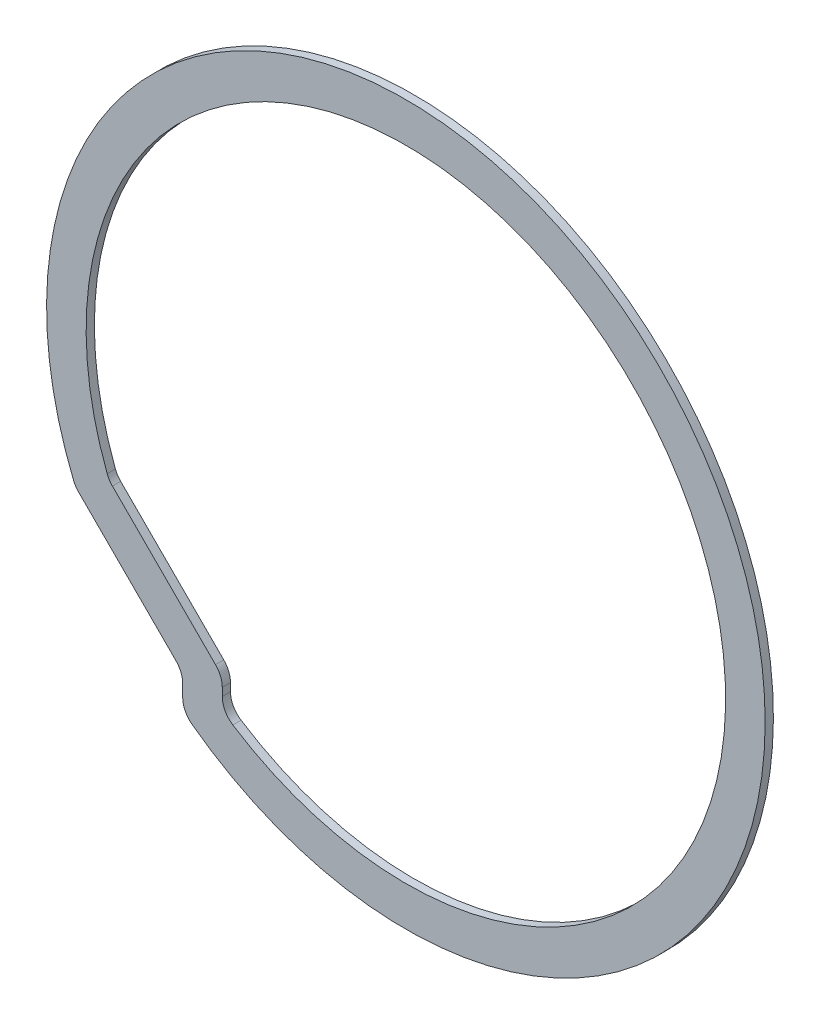
ISO-10303-21;
HEADER;
FILE_DESCRIPTION(('STEP AP214'),'2;1');
FILE_NAME('part.step','',(''),(''),'','','');
FILE_SCHEMA(('AUTOMOTIVE_DESIGN { 1 0 10303 214 1 1 1 1 }'));
ENDSEC;
DATA;
#1=APPLICATION_CONTEXT('core data for automotive mechanical design processes');
#2=APPLICATION_PROTOCOL_DEFINITION('international standard','automotive_design',2000,#1);
#3=PRODUCT_CONTEXT('',#1,'mechanical');
#4=PRODUCT('Part','Part','',(#3));
#5=PRODUCT_RELATED_PRODUCT_CATEGORY('part','',(#4));
#6=PRODUCT_DEFINITION_FORMATION('','',#4);
#7=PRODUCT_DEFINITION_CONTEXT('part definition',#1,'design');
#8=PRODUCT_DEFINITION('design','',#6,#7);
#9=PRODUCT_DEFINITION_SHAPE('','',#8);
#10=(LENGTH_UNIT() NAMED_UNIT(*) SI_UNIT(.MILLI.,.METRE.));
#11=(NAMED_UNIT(*) PLANE_ANGLE_UNIT() SI_UNIT($,.RADIAN.));
#12=(NAMED_UNIT(*) SI_UNIT($,.STERADIAN.) SOLID_ANGLE_UNIT());
#13=UNCERTAINTY_MEASURE_WITH_UNIT(LENGTH_MEASURE(1.E-05),#10,'distance_accuracy_value','');
#14=(GEOMETRIC_REPRESENTATION_CONTEXT(3) GLOBAL_UNCERTAINTY_ASSIGNED_CONTEXT((#13)) GLOBAL_UNIT_ASSIGNED_CONTEXT((#10,
#11,#12)) REPRESENTATION_CONTEXT('',''));
#15=CARTESIAN_POINT('',(0.,0.,0.));
#16=DIRECTION('',(0.,0.,1.));
#17=DIRECTION('',(1.,0.,0.));
#18=AXIS2_PLACEMENT_3D('',#15,#16,#17);
#19=CARTESIAN_POINT('',(-127.29330891879,-32.5552500362416,1.5875));
#20=DIRECTION('',(0.707106781186544,0.707106781186551,0.));
#21=DIRECTION('',(-0.707106781186551,0.707106781186544,0.));
#22=AXIS2_PLACEMENT_3D('',#19,#20,#21);
#23=PLANE('',#22);
#24=DIRECTION('',(0.707106781186551,-0.707106781186544,0.));
#25=VECTOR('',#24,1.);
#26=CARTESIAN_POINT('',(-127.29330891879,-32.5552500362416,1.5875));
#27=LINE('',#26,#25);
#28=CARTESIAN_POINT('',(-126.058425895892,-33.7901330591397,1.5875));
#29=VERTEX_POINT('',#28);
#30=CARTESIAN_POINT('',(-88.5879514771231,-71.2606074779079,1.5875));
#31=VERTEX_POINT('',#30);
#32=EDGE_CURVE('E144',#29,#31,#27,.T.);
#33=ORIENTED_EDGE('',*,*,#32,.F.);
#34=DIRECTION('',(0.,0.,-1.));
#35=VECTOR('',#34,1.);
#36=CARTESIAN_POINT('',(-126.058425895892,-33.7901330591397,1.5875));
#37=LINE('',#36,#35);
#38=CARTESIAN_POINT('',(-126.058425895892,-33.7901330591397,-1.5875));
#39=VERTEX_POINT('',#38);
#40=EDGE_CURVE('E130',#29,#39,#37,.T.);
#41=ORIENTED_EDGE('',*,*,#40,.T.);
#42=DIRECTION('',(0.707106781186551,-0.707106781186544,0.));
#43=VECTOR('',#42,1.);
#44=CARTESIAN_POINT('',(-127.29330891879,-32.5552500362416,-1.5875));
#45=LINE('',#44,#43);
#46=CARTESIAN_POINT('',(-88.5879514771231,-71.2606074779079,-1.5875));
#47=VERTEX_POINT('',#46);
#48=EDGE_CURVE('E142',#39,#47,#45,.T.);
#49=ORIENTED_EDGE('',*,*,#48,.T.);
#50=DIRECTION('',(0.,0.,-1.));
#51=VECTOR('',#50,1.);
#52=CARTESIAN_POINT('',(-88.5879514771232,-71.2606074779079,1.5875));
#53=LINE('',#52,#51);
#54=EDGE_CURVE('E146',#47,#31,#53,.F.);
#55=ORIENTED_EDGE('',*,*,#54,.T.);
#56=EDGE_LOOP('',(#33,#41,#49,#55));
#57=FACE_BOUND('',#56,.T.);
#58=ADVANCED_FACE('F36',(#57),#23,.F.);
#59=CARTESIAN_POINT('',(-85.9841307618715,-73.8644281931595,1.5875));
#60=DIRECTION('',(1.,0.,0.));
#61=DIRECTION('',(0.,1.,0.));
#62=AXIS2_PLACEMENT_3D('',#59,#60,#61);
#63=PLANE('',#62);
#64=DIRECTION('',(0.,-1.,0.));
#65=VECTOR('',#64,1.);
#66=CARTESIAN_POINT('',(-85.9841307618715,-73.8644281931595,1.5875));
#67=LINE('',#66,#65);
#68=CARTESIAN_POINT('',(-85.9841307618715,-77.5467867626563,1.5875));
#69=VERTEX_POINT('',#68);
#70=CARTESIAN_POINT('',(-85.9841307618715,-82.2574245919404,1.5875));
#71=VERTEX_POINT('',#70);
#72=EDGE_CURVE('E160',#69,#71,#67,.T.);
#73=ORIENTED_EDGE('',*,*,#72,.F.);
#74=DIRECTION('',(0.,0.,-1.));
#75=VECTOR('',#74,1.);
#76=CARTESIAN_POINT('',(-85.9841307618715,-77.5467867626563,-1.5875));
#77=LINE('',#76,#75);
#78=CARTESIAN_POINT('',(-85.9841307618715,-77.5467867626563,-1.5875));
#79=VERTEX_POINT('',#78);
#80=EDGE_CURVE('E188',#69,#79,#77,.T.);
#81=ORIENTED_EDGE('',*,*,#80,.T.);
#82=DIRECTION('',(0.,-1.,0.));
#83=VECTOR('',#82,1.);
#84=CARTESIAN_POINT('',(-85.9841307618715,-73.8644281931595,-1.5875));
#85=LINE('',#84,#83);
#86=CARTESIAN_POINT('',(-85.9841307618715,-82.2574245919404,-1.5875));
#87=VERTEX_POINT('',#86);
#88=EDGE_CURVE('E151',#79,#87,#85,.T.);
#89=ORIENTED_EDGE('',*,*,#88,.T.);
#90=DIRECTION('',(0.,0.,-1.));
#91=VECTOR('',#90,1.);
#92=CARTESIAN_POINT('',(-85.9841307618715,-82.2574245919404,1.5875));
#93=LINE('',#92,#91);
#94=EDGE_CURVE('E51',#87,#71,#93,.F.);
#95=ORIENTED_EDGE('',*,*,#94,.T.);
#96=EDGE_LOOP('',(#73,#81,#89,#95));
#97=FACE_BOUND('',#96,.T.);
#98=ADVANCED_FACE('F244',(#97),#63,.F.);
#99=CARTESIAN_POINT('',(0.,21.844,1.5875));
#100=DIRECTION('',(0.,0.,-1.));
#101=DIRECTION('',(-1.,0.,0.));
#102=AXIS2_PLACEMENT_3D('',#99,#100,#101);
#103=CYLINDRICAL_SURFACE('',#102,138.43);
#104=CARTESIAN_POINT('',(0.,21.844,-1.5875));
#105=DIRECTION('',(0.,0.,1.));
#106=DIRECTION('',(1.,0.,0.));
#107=AXIS2_PLACEMENT_3D('',#104,#105,#106);
#108=CIRCLE('',#107,138.43);
#109=CARTESIAN_POINT('',(-82.3849044416078,-89.4016400051128,-1.5875));
#110=VERTEX_POINT('',#109);
#111=CARTESIAN_POINT('',(-127.991910594261,-30.8905780530259,-1.5875));
#112=VERTEX_POINT('',#111);
#113=EDGE_CURVE('E154',#110,#112,#108,.T.);
#114=ORIENTED_EDGE('',*,*,#113,.T.);
#115=DIRECTION('',(0.,0.,-1.));
#116=VECTOR('',#115,1.);
#117=CARTESIAN_POINT('',(-127.991910594261,-30.8905780530259,1.5875));
#118=LINE('',#117,#116);
#119=CARTESIAN_POINT('',(-127.991910594261,-30.8905780530259,1.5875));
#120=VERTEX_POINT('',#119);
#121=EDGE_CURVE('E131',#112,#120,#118,.F.);
#122=ORIENTED_EDGE('',*,*,#121,.T.);
#123=CARTESIAN_POINT('',(0.,21.844,1.5875));
#124=DIRECTION('',(0.,0.,1.));
#125=DIRECTION('',(1.,0.,0.));
#126=AXIS2_PLACEMENT_3D('',#123,#124,#125);
#127=CIRCLE('',#126,138.43);
#128=CARTESIAN_POINT('',(-82.3849044416078,-89.4016400051128,1.5875));
#129=VERTEX_POINT('',#128);
#130=EDGE_CURVE('E164',#129,#120,#127,.T.);
#131=ORIENTED_EDGE('',*,*,#130,.F.);
#132=DIRECTION('',(0.,0.,-1.));
#133=VECTOR('',#132,1.);
#134=CARTESIAN_POINT('',(-82.3849044416078,-89.4016400051128,1.5875));
#135=LINE('',#134,#133);
#136=EDGE_CURVE('E136',#129,#110,#135,.T.);
#137=ORIENTED_EDGE('',*,*,#136,.T.);
#138=EDGE_LOOP('',(#114,#122,#131,#137));
#139=FACE_BOUND('',#138,.T.);
#140=ADVANCED_FACE('F243',(#139),#103,.T.);
#141=CARTESIAN_POINT('',(0.,21.844,1.5875));
#142=DIRECTION('',(0.,0.,1.));
#143=DIRECTION('',(1.,0.,0.));
#144=AXIS2_PLACEMENT_3D('',#141,#142,#143);
#145=PLANE('',#144);
#146=DIRECTION('',(0.,-1.,0.));
#147=VECTOR('',#146,1.);
#148=CARTESIAN_POINT('',(-70.7441307618716,-67.5518135025934,1.5875));
#149=LINE('',#148,#147);
#150=CARTESIAN_POINT('',(-70.7441307618716,-71.2341720720902,1.5875));
#151=VERTEX_POINT('',#150);
#152=CARTESIAN_POINT('',(-70.7441307618716,-74.2734100134481,1.5875));
#153=VERTEX_POINT('',#152);
#154=EDGE_CURVE('E206',#151,#153,#149,.T.);
#155=ORIENTED_EDGE('',*,*,#154,.F.);
#156=CARTESIAN_POINT('',(-79.6341307618716,-71.2341720720902,1.58750000000002));
#157=DIRECTION('',(0.,0.,1.));
#158=DIRECTION('',(1.,0.,0.));
#159=AXIS2_PLACEMENT_3D('',#156,#157,#158);
#160=CIRCLE('',#159,8.89);
#161=CARTESIAN_POINT('',(-73.3479514771232,-64.9479927873418,1.5875));
#162=VERTEX_POINT('',#161);
#163=EDGE_CURVE('E171',#151,#162,#160,.T.);
#164=ORIENTED_EDGE('',*,*,#163,.T.);
#165=DIRECTION('',(0.707106781186551,-0.707106781186543,0.));
#166=VECTOR('',#165,1.);
#167=CARTESIAN_POINT('',(-114.372852663516,-23.9230916009497,1.5875));
#168=LINE('',#167,#166);
#169=CARTESIAN_POINT('',(-113.057801903824,-25.238142360641,1.5875));
#170=VERTEX_POINT('',#169);
#171=EDGE_CURVE('E218',#170,#162,#168,.T.);
#172=ORIENTED_EDGE('',*,*,#171,.F.);
#173=CARTESIAN_POINT('',(-106.771622619076,-18.9519630758925,1.58750000000002));
#174=DIRECTION('',(0.,0.,1.));
#175=DIRECTION('',(1.,0.,0.));
#176=AXIS2_PLACEMENT_3D('',#173,#174,#175);
#177=CIRCLE('',#176,8.89);
#178=CARTESIAN_POINT('',(-115.076082156115,-22.1249824262397,1.5875));
#179=VERTEX_POINT('',#178);
#180=EDGE_CURVE('E196',#170,#179,#177,.F.);
#181=ORIENTED_EDGE('',*,*,#180,.T.);
#182=CARTESIAN_POINT('',(0.,21.844,1.5875));
#183=DIRECTION('',(0.,0.,1.));
#184=DIRECTION('',(1.,0.,0.));
#185=AXIS2_PLACEMENT_3D('',#182,#183,#184);
#186=CIRCLE('',#185,123.19);
#187=CARTESIAN_POINT('',(-66.665007598906,-81.7492085700496,1.5875));
#188=VERTEX_POINT('',#187);
#189=EDGE_CURVE('E208',#188,#179,#186,.T.);
#190=ORIENTED_EDGE('',*,*,#189,.F.);
#191=CARTESIAN_POINT('',(-61.8541307618715,-74.2734100134481,1.58750000000002));
#192=DIRECTION('',(0.,0.,1.));
#193=DIRECTION('',(1.,0.,0.));
#194=AXIS2_PLACEMENT_3D('',#191,#192,#193);
#195=CIRCLE('',#194,8.89);
#196=EDGE_CURVE('E44',#188,#153,#195,.F.);
#197=ORIENTED_EDGE('',*,*,#196,.T.);
#198=EDGE_LOOP('',(#155,#164,#172,#181,#190,#197));
#199=FACE_BOUND('',#198,.T.);
#200=ORIENTED_EDGE('',*,*,#130,.T.);
#201=CARTESIAN_POINT('',(-119.772246611143,-27.5039537743912,1.5875));
#202=DIRECTION('',(0.,0.,1.));
#203=DIRECTION('',(1.,0.,0.));
#204=AXIS2_PLACEMENT_3D('',#201,#202,#203);
#205=CIRCLE('',#204,8.89);
#206=EDGE_CURVE('E175',#120,#29,#205,.T.);
#207=ORIENTED_EDGE('',*,*,#206,.T.);
#208=ORIENTED_EDGE('',*,*,#32,.T.);
#209=CARTESIAN_POINT('',(-94.8741307618715,-77.5467867626563,1.5875));
#210=DIRECTION('',(0.,0.,1.));
#211=DIRECTION('',(1.,0.,0.));
#212=AXIS2_PLACEMENT_3D('',#209,#210,#211);
#213=CIRCLE('',#212,8.89);
#214=EDGE_CURVE('E58',#31,#69,#213,.F.);
#215=ORIENTED_EDGE('',*,*,#214,.T.);
#216=ORIENTED_EDGE('',*,*,#72,.T.);
#217=CARTESIAN_POINT('',(-77.0941307618715,-82.2574245919404,1.5875));
#218=DIRECTION('',(0.,0.,1.));
#219=DIRECTION('',(1.,0.,0.));
#220=AXIS2_PLACEMENT_3D('',#217,#218,#219);
#221=CIRCLE('',#220,8.89);
#222=EDGE_CURVE('E173',#71,#129,#221,.T.);
#223=ORIENTED_EDGE('',*,*,#222,.T.);
#224=EDGE_LOOP('',(#200,#207,#208,#215,#216,#223));
#225=FACE_BOUND('',#224,.T.);
#226=ADVANCED_FACE('F205',(#199,#225),#145,.T.);
#227=CARTESIAN_POINT('',(0.,21.844,-1.5875));
#228=DIRECTION('',(0.,0.,1.));
#229=DIRECTION('',(1.,0.,0.));
#230=AXIS2_PLACEMENT_3D('',#227,#228,#229);
#231=PLANE('',#230);
#232=DIRECTION('',(-0.707106781186552,0.707106781186543,0.));
#233=VECTOR('',#232,1.);
#234=CARTESIAN_POINT('',(-114.372852663516,-23.9230916009497,-1.58750000000002));
#235=LINE('',#234,#233);
#236=CARTESIAN_POINT('',(-73.3479514771232,-64.9479927873418,-1.58750000000002));
#237=VERTEX_POINT('',#236);
#238=CARTESIAN_POINT('',(-113.057801903824,-25.238142360641,-1.58750000000002));
#239=VERTEX_POINT('',#238);
#240=EDGE_CURVE('E152',#237,#239,#235,.T.);
#241=ORIENTED_EDGE('',*,*,#240,.F.);
#242=CARTESIAN_POINT('',(-79.6341307618716,-71.2341720720902,-1.58750000000002));
#243=DIRECTION('',(0.,0.,1.));
#244=DIRECTION('',(1.,0.,0.));
#245=AXIS2_PLACEMENT_3D('',#242,#243,#244);
#246=CIRCLE('',#245,8.89);
#247=CARTESIAN_POINT('',(-70.7441307618716,-71.2341720720902,-1.58750000000002));
#248=VERTEX_POINT('',#247);
#249=EDGE_CURVE('E145',#237,#248,#246,.F.);
#250=ORIENTED_EDGE('',*,*,#249,.T.);
#251=DIRECTION('',(0.,1.,0.));
#252=VECTOR('',#251,1.);
#253=CARTESIAN_POINT('',(-70.7441307618716,-67.5518135025934,-1.58750000000002));
#254=LINE('',#253,#252);
#255=CARTESIAN_POINT('',(-70.7441307618716,-74.2734100134481,-1.58750000000002));
#256=VERTEX_POINT('',#255);
#257=EDGE_CURVE('E217',#256,#248,#254,.T.);
#258=ORIENTED_EDGE('',*,*,#257,.F.);
#259=CARTESIAN_POINT('',(-61.8541307618715,-74.2734100134481,-1.58750000000002));
#260=DIRECTION('',(0.,0.,1.));
#261=DIRECTION('',(1.,0.,0.));
#262=AXIS2_PLACEMENT_3D('',#259,#260,#261);
#263=CIRCLE('',#262,8.89);
#264=CARTESIAN_POINT('',(-66.665007598906,-81.7492085700496,-1.58750000000002));
#265=VERTEX_POINT('',#264);
#266=EDGE_CURVE('E11',#256,#265,#263,.T.);
#267=ORIENTED_EDGE('',*,*,#266,.T.);
#268=CARTESIAN_POINT('',(0.,21.844,-1.58750000000002));
#269=DIRECTION('',(0.,0.,1.));
#270=DIRECTION('',(1.,0.,0.));
#271=AXIS2_PLACEMENT_3D('',#268,#269,#270);
#272=CIRCLE('',#271,123.19);
#273=CARTESIAN_POINT('',(-115.076082156115,-22.1249824262397,-1.58750000000002));
#274=VERTEX_POINT('',#273);
#275=EDGE_CURVE('E157',#274,#265,#272,.F.);
#276=ORIENTED_EDGE('',*,*,#275,.F.);
#277=CARTESIAN_POINT('',(-106.771622619076,-18.9519630758925,-1.58750000000002));
#278=DIRECTION('',(0.,0.,1.));
#279=DIRECTION('',(1.,0.,0.));
#280=AXIS2_PLACEMENT_3D('',#277,#278,#279);
#281=CIRCLE('',#280,8.89);
#282=EDGE_CURVE('E198',#274,#239,#281,.T.);
#283=ORIENTED_EDGE('',*,*,#282,.T.);
#284=EDGE_LOOP('',(#241,#250,#258,#267,#276,#283));
#285=FACE_BOUND('',#284,.T.);
#286=ORIENTED_EDGE('',*,*,#48,.F.);
#287=CARTESIAN_POINT('',(-119.772246611143,-27.5039537743912,-1.5875));
#288=DIRECTION('',(0.,0.,1.));
#289=DIRECTION('',(1.,0.,0.));
#290=AXIS2_PLACEMENT_3D('',#287,#288,#289);
#291=CIRCLE('',#290,8.89);
#292=EDGE_CURVE('E126',#39,#112,#291,.F.);
#293=ORIENTED_EDGE('',*,*,#292,.T.);
#294=ORIENTED_EDGE('',*,*,#113,.F.);
#295=CARTESIAN_POINT('',(-77.0941307618715,-82.2574245919404,-1.5875));
#296=DIRECTION('',(0.,0.,1.));
#297=DIRECTION('',(1.,0.,0.));
#298=AXIS2_PLACEMENT_3D('',#295,#296,#297);
#299=CIRCLE('',#298,8.89);
#300=EDGE_CURVE('E137',#110,#87,#299,.F.);
#301=ORIENTED_EDGE('',*,*,#300,.T.);
#302=ORIENTED_EDGE('',*,*,#88,.F.);
#303=CARTESIAN_POINT('',(-94.8741307618715,-77.5467867626563,-1.5875));
#304=DIRECTION('',(0.,0.,1.));
#305=DIRECTION('',(1.,0.,0.));
#306=AXIS2_PLACEMENT_3D('',#303,#304,#305);
#307=CIRCLE('',#306,8.89);
#308=EDGE_CURVE('E150',#79,#47,#307,.T.);
#309=ORIENTED_EDGE('',*,*,#308,.T.);
#310=EDGE_LOOP('',(#286,#293,#294,#301,#302,#309));
#311=FACE_BOUND('',#310,.T.);
#312=ADVANCED_FACE('F148',(#285,#311),#231,.F.);
#313=CARTESIAN_POINT('',(0.,21.844,-350.021437497483));
#314=DIRECTION('',(0.,0.,1.));
#315=DIRECTION('',(1.,0.,0.));
#316=AXIS2_PLACEMENT_3D('',#313,#314,#315);
#317=CYLINDRICAL_SURFACE('',#316,123.19);
#318=ORIENTED_EDGE('',*,*,#189,.T.);
#319=DIRECTION('',(0.,0.,1.));
#320=VECTOR('',#319,1.);
#321=CARTESIAN_POINT('',(-115.076082156115,-22.1249824262397,-350.021437497483));
#322=LINE('',#321,#320);
#323=EDGE_CURVE('E185',#179,#274,#322,.F.);
#324=ORIENTED_EDGE('',*,*,#323,.T.);
#325=ORIENTED_EDGE('',*,*,#275,.T.);
#326=DIRECTION('',(0.,0.,1.));
#327=VECTOR('',#326,1.);
#328=CARTESIAN_POINT('',(-66.665007598906,-81.7492085700496,-350.021437497483));
#329=LINE('',#328,#327);
#330=EDGE_CURVE('E182',#265,#188,#329,.T.);
#331=ORIENTED_EDGE('',*,*,#330,.T.);
#332=EDGE_LOOP('',(#318,#324,#325,#331));
#333=FACE_BOUND('',#332,.T.);
#334=ADVANCED_FACE('F227',(#333),#317,.F.);
#335=CARTESIAN_POINT('',(-70.7441307618716,-67.5518135025934,-350.021437497483));
#336=DIRECTION('',(-1.,0.,0.));
#337=DIRECTION('',(0.,-1.,0.));
#338=AXIS2_PLACEMENT_3D('',#335,#336,#337);
#339=PLANE('',#338);
#340=ORIENTED_EDGE('',*,*,#257,.T.);
#341=DIRECTION('',(0.,0.,1.));
#342=VECTOR('',#341,1.);
#343=CARTESIAN_POINT('',(-70.7441307618716,-71.2341720720902,-350.021437497483));
#344=LINE('',#343,#342);
#345=EDGE_CURVE('E193',#248,#151,#344,.T.);
#346=ORIENTED_EDGE('',*,*,#345,.T.);
#347=ORIENTED_EDGE('',*,*,#154,.T.);
#348=DIRECTION('',(0.,0.,-1.));
#349=VECTOR('',#348,1.);
#350=CARTESIAN_POINT('',(-70.7441307618716,-74.2734100134481,-1.58750000000013));
#351=LINE('',#350,#349);
#352=EDGE_CURVE('E191',#153,#256,#351,.T.);
#353=ORIENTED_EDGE('',*,*,#352,.T.);
#354=EDGE_LOOP('',(#340,#346,#347,#353));
#355=FACE_BOUND('',#354,.T.);
#356=ADVANCED_FACE('F214',(#355),#339,.F.);
#357=CARTESIAN_POINT('',(-114.372852663516,-23.9230916009497,-350.021437497483));
#358=DIRECTION('',(-0.707106781186543,-0.707106781186552,0.));
#359=DIRECTION('',(0.707106781186552,-0.707106781186543,0.));
#360=AXIS2_PLACEMENT_3D('',#357,#358,#359);
#361=PLANE('',#360);
#362=ORIENTED_EDGE('',*,*,#240,.T.);
#363=DIRECTION('',(0.,0.,-1.));
#364=VECTOR('',#363,1.);
#365=CARTESIAN_POINT('',(-113.057801903824,-25.238142360641,1.58749999999991));
#366=LINE('',#365,#364);
#367=EDGE_CURVE('E179',#239,#170,#366,.F.);
#368=ORIENTED_EDGE('',*,*,#367,.T.);
#369=ORIENTED_EDGE('',*,*,#171,.T.);
#370=DIRECTION('',(0.,0.,1.));
#371=VECTOR('',#370,1.);
#372=CARTESIAN_POINT('',(-73.3479514771232,-64.9479927873418,-350.021437497483));
#373=LINE('',#372,#371);
#374=EDGE_CURVE('E177',#162,#237,#373,.F.);
#375=ORIENTED_EDGE('',*,*,#374,.T.);
#376=EDGE_LOOP('',(#362,#368,#369,#375));
#377=FACE_BOUND('',#376,.T.);
#378=ADVANCED_FACE('F267',(#377),#361,.F.);
#379=CARTESIAN_POINT('',(-119.772246611143,-27.5039537743912,1.5875));
#380=DIRECTION('',(0.,0.,-1.));
#381=DIRECTION('',(-1.,0.,0.));
#382=AXIS2_PLACEMENT_3D('',#379,#380,#381);
#383=CYLINDRICAL_SURFACE('',#382,8.89);
#384=ORIENTED_EDGE('',*,*,#206,.F.);
#385=ORIENTED_EDGE('',*,*,#121,.F.);
#386=ORIENTED_EDGE('',*,*,#292,.F.);
#387=ORIENTED_EDGE('',*,*,#40,.F.);
#388=EDGE_LOOP('',(#384,#385,#386,#387));
#389=FACE_BOUND('',#388,.T.);
#390=ADVANCED_FACE('F129',(#389),#383,.T.);
#391=CARTESIAN_POINT('',(-106.771622619076,-18.9519630758925,-350.021437497483));
#392=DIRECTION('',(0.,0.,1.));
#393=DIRECTION('',(1.,0.,0.));
#394=AXIS2_PLACEMENT_3D('',#391,#392,#393);
#395=CYLINDRICAL_SURFACE('',#394,8.89);
#396=ORIENTED_EDGE('',*,*,#282,.F.);
#397=ORIENTED_EDGE('',*,*,#323,.F.);
#398=ORIENTED_EDGE('',*,*,#180,.F.);
#399=ORIENTED_EDGE('',*,*,#367,.F.);
#400=EDGE_LOOP('',(#396,#397,#398,#399));
#401=FACE_BOUND('',#400,.T.);
#402=ADVANCED_FACE('F248',(#401),#395,.F.);
#403=CARTESIAN_POINT('',(-94.8741307618715,-77.5467867626563,1.5875));
#404=DIRECTION('',(0.,0.,1.));
#405=DIRECTION('',(1.,0.,0.));
#406=AXIS2_PLACEMENT_3D('',#403,#404,#405);
#407=CYLINDRICAL_SURFACE('',#406,8.89);
#408=ORIENTED_EDGE('',*,*,#214,.F.);
#409=ORIENTED_EDGE('',*,*,#54,.F.);
#410=ORIENTED_EDGE('',*,*,#308,.F.);
#411=ORIENTED_EDGE('',*,*,#80,.F.);
#412=EDGE_LOOP('',(#408,#409,#410,#411));
#413=FACE_BOUND('',#412,.T.);
#414=ADVANCED_FACE('F246',(#413),#407,.F.);
#415=CARTESIAN_POINT('',(-77.0941307618715,-82.2574245919404,1.5875));
#416=DIRECTION('',(0.,0.,-1.));
#417=DIRECTION('',(-1.,0.,0.));
#418=AXIS2_PLACEMENT_3D('',#415,#416,#417);
#419=CYLINDRICAL_SURFACE('',#418,8.89);
#420=ORIENTED_EDGE('',*,*,#222,.F.);
#421=ORIENTED_EDGE('',*,*,#94,.F.);
#422=ORIENTED_EDGE('',*,*,#300,.F.);
#423=ORIENTED_EDGE('',*,*,#136,.F.);
#424=EDGE_LOOP('',(#420,#421,#422,#423));
#425=FACE_BOUND('',#424,.T.);
#426=ADVANCED_FACE('F241',(#425),#419,.T.);
#427=CARTESIAN_POINT('',(-79.6341307618716,-71.2341720720902,-350.021437497483));
#428=DIRECTION('',(0.,0.,1.));
#429=DIRECTION('',(1.,0.,0.));
#430=AXIS2_PLACEMENT_3D('',#427,#428,#429);
#431=CYLINDRICAL_SURFACE('',#430,8.89);
#432=ORIENTED_EDGE('',*,*,#249,.F.);
#433=ORIENTED_EDGE('',*,*,#374,.F.);
#434=ORIENTED_EDGE('',*,*,#163,.F.);
#435=ORIENTED_EDGE('',*,*,#345,.F.);
#436=EDGE_LOOP('',(#432,#433,#434,#435));
#437=FACE_BOUND('',#436,.T.);
#438=ADVANCED_FACE('F254',(#437),#431,.T.);
#439=CARTESIAN_POINT('',(-61.8541307618715,-74.2734100134481,-350.021437497483));
#440=DIRECTION('',(0.,0.,1.));
#441=DIRECTION('',(1.,0.,0.));
#442=AXIS2_PLACEMENT_3D('',#439,#440,#441);
#443=CYLINDRICAL_SURFACE('',#442,8.89);
#444=ORIENTED_EDGE('',*,*,#266,.F.);
#445=ORIENTED_EDGE('',*,*,#352,.F.);
#446=ORIENTED_EDGE('',*,*,#196,.F.);
#447=ORIENTED_EDGE('',*,*,#330,.F.);
#448=EDGE_LOOP('',(#444,#445,#446,#447));
#449=FACE_BOUND('',#448,.T.);
#450=ADVANCED_FACE('F38',(#449),#443,.F.);
#451=CLOSED_SHELL('',(#58,#98,#140,#226,#312,#334,#356,#378,#390,#402,#414,#426,#438,#450));
#452=MANIFOLD_SOLID_BREP('B2',#451);
#453=ADVANCED_BREP_SHAPE_REPRESENTATION('',(#18,#452),#14);
#454=SHAPE_DEFINITION_REPRESENTATION(#9,#453);
ENDSEC;
END-ISO-10303-21;
